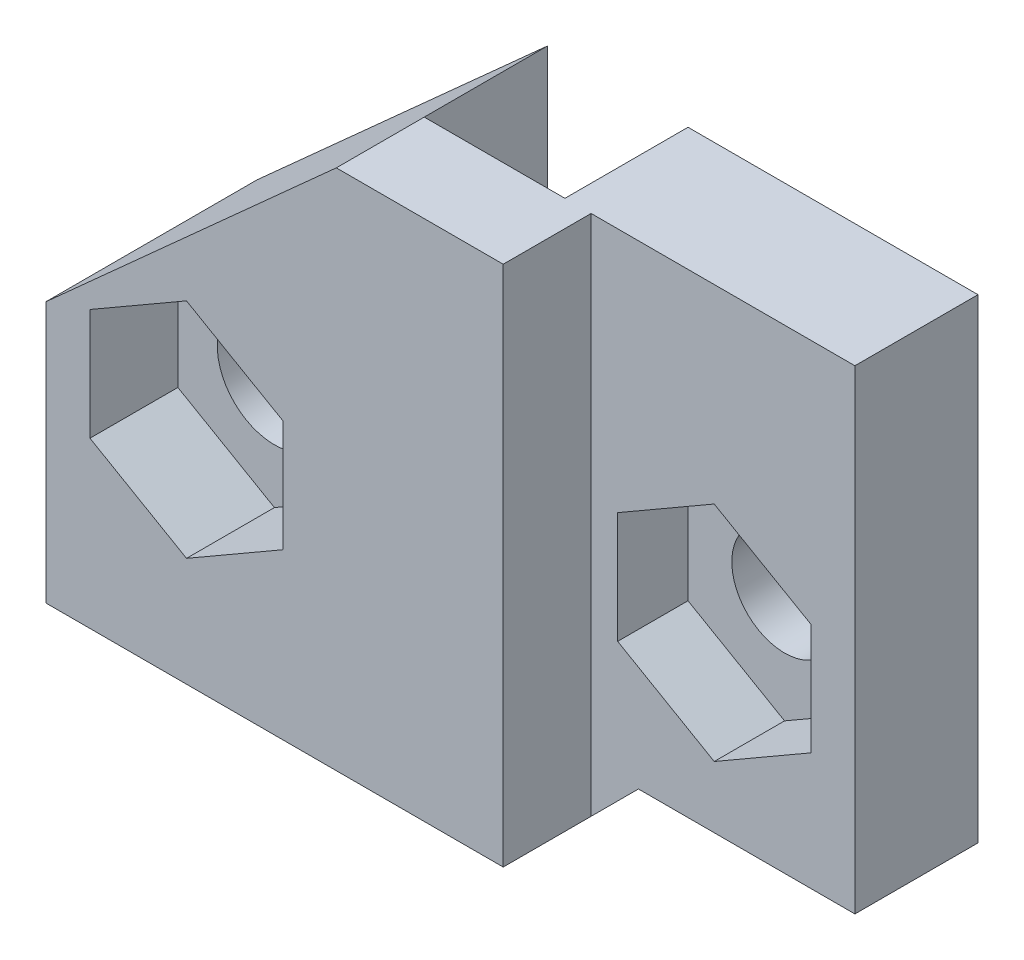
ISO-10303-21;
HEADER;
FILE_DESCRIPTION(('STEP AP214'),'2;1');
FILE_NAME('part.step','',(''),(''),'','','');
FILE_SCHEMA(('AUTOMOTIVE_DESIGN { 1 0 10303 214 1 1 1 1 }'));
ENDSEC;
DATA;
#1=APPLICATION_CONTEXT('core data for automotive mechanical design processes');
#2=APPLICATION_PROTOCOL_DEFINITION('international standard','automotive_design',2000,#1);
#3=PRODUCT_CONTEXT('',#1,'mechanical');
#4=PRODUCT('Part','Part','',(#3));
#5=PRODUCT_RELATED_PRODUCT_CATEGORY('part','',(#4));
#6=PRODUCT_DEFINITION_FORMATION('','',#4);
#7=PRODUCT_DEFINITION_CONTEXT('part definition',#1,'design');
#8=PRODUCT_DEFINITION('design','',#6,#7);
#9=PRODUCT_DEFINITION_SHAPE('','',#8);
#10=(LENGTH_UNIT() NAMED_UNIT(*) SI_UNIT(.MILLI.,.METRE.));
#11=(NAMED_UNIT(*) PLANE_ANGLE_UNIT() SI_UNIT($,.RADIAN.));
#12=(NAMED_UNIT(*) SI_UNIT($,.STERADIAN.) SOLID_ANGLE_UNIT());
#13=UNCERTAINTY_MEASURE_WITH_UNIT(LENGTH_MEASURE(1.E-05),#10,'distance_accuracy_value','');
#14=(GEOMETRIC_REPRESENTATION_CONTEXT(3) GLOBAL_UNCERTAINTY_ASSIGNED_CONTEXT((#13)) GLOBAL_UNIT_ASSIGNED_CONTEXT((#10,
#11,#12)) REPRESENTATION_CONTEXT('',''));
#15=CARTESIAN_POINT('',(0.,0.,0.));
#16=DIRECTION('',(0.,0.,1.));
#17=DIRECTION('',(1.,0.,0.));
#18=AXIS2_PLACEMENT_3D('',#15,#16,#17);
#19=CARTESIAN_POINT('',(79.72767153,-75.223646,6.));
#20=DIRECTION('',(0.,0.,-1.));
#21=DIRECTION('',(-1.,0.,0.));
#22=AXIS2_PLACEMENT_3D('',#19,#20,#21);
#23=CYLINDRICAL_SURFACE('',#22,1.625);
#24=CARTESIAN_POINT('',(79.72767153,-75.223646,0.));
#25=DIRECTION('',(0.,0.,1.));
#26=DIRECTION('',(1.,0.,0.));
#27=AXIS2_PLACEMENT_3D('',#24,#25,#26);
#28=CIRCLE('',#27,1.625);
#29=CARTESIAN_POINT('',(81.35267153,-75.223646,0.));
#30=VERTEX_POINT('',#29);
#31=EDGE_CURVE('E261',#30,#30,#28,.T.);
#32=ORIENTED_EDGE('',*,*,#31,.F.);
#33=EDGE_LOOP('',(#32));
#34=FACE_BOUND('',#33,.T.);
#35=CARTESIAN_POINT('',(79.72767153,-75.223646,3.5));
#36=DIRECTION('',(0.,0.,1.));
#37=DIRECTION('',(1.,0.,0.));
#38=AXIS2_PLACEMENT_3D('',#35,#36,#37);
#39=CIRCLE('',#38,1.625);
#40=CARTESIAN_POINT('',(81.35267153,-75.223646,3.5));
#41=VERTEX_POINT('',#40);
#42=EDGE_CURVE('E37',#41,#41,#39,.T.);
#43=ORIENTED_EDGE('',*,*,#42,.T.);
#44=EDGE_LOOP('',(#43));
#45=FACE_BOUND('',#44,.T.);
#46=ADVANCED_FACE('F33',(#34,#45),#23,.F.);
#47=CARTESIAN_POINT('',(87.9870704700034,-75.223646,6.));
#48=DIRECTION('',(1.,0.,0.));
#49=DIRECTION('',(0.,0.,-1.));
#50=AXIS2_PLACEMENT_3D('',#47,#48,#49);
#51=PLANE('',#50);
#52=DIRECTION('',(0.,1.,0.));
#53=VECTOR('',#52,1.);
#54=CARTESIAN_POINT('',(87.9870704700034,-66.648646,3.5));
#55=LINE('',#54,#53);
#56=CARTESIAN_POINT('',(87.9870704700034,-75.223646,3.5));
#57=VERTEX_POINT('',#56);
#58=CARTESIAN_POINT('',(87.9870704700034,-66.648646,3.5));
#59=VERTEX_POINT('',#58);
#60=EDGE_CURVE('E257',#57,#59,#55,.T.);
#61=ORIENTED_EDGE('',*,*,#60,.T.);
#62=DIRECTION('',(0.,0.,-1.));
#63=VECTOR('',#62,1.);
#64=CARTESIAN_POINT('',(87.9870704700034,-66.648646,6.));
#65=LINE('',#64,#63);
#66=CARTESIAN_POINT('',(87.9870704700034,-66.648646,0.));
#67=VERTEX_POINT('',#66);
#68=EDGE_CURVE('E306',#59,#67,#65,.T.);
#69=ORIENTED_EDGE('',*,*,#68,.T.);
#70=DIRECTION('',(0.,-1.,0.));
#71=VECTOR('',#70,1.);
#72=CARTESIAN_POINT('',(87.9870704700034,-75.223646,0.));
#73=LINE('',#72,#71);
#74=CARTESIAN_POINT('',(87.9870704700034,-75.223646,0.));
#75=VERTEX_POINT('',#74);
#76=EDGE_CURVE('E264',#67,#75,#73,.T.);
#77=ORIENTED_EDGE('',*,*,#76,.T.);
#78=DIRECTION('',(0.,0.,-1.));
#79=VECTOR('',#78,1.);
#80=CARTESIAN_POINT('',(87.9870704700034,-75.223646,6.));
#81=LINE('',#80,#79);
#82=EDGE_CURVE('E304',#57,#75,#81,.T.);
#83=ORIENTED_EDGE('',*,*,#82,.F.);
#84=EDGE_LOOP('',(#61,#69,#77,#83));
#85=FACE_BOUND('',#84,.T.);
#86=ADVANCED_FACE('F468',(#85),#51,.F.);
#87=CARTESIAN_POINT('',(83.9870704700034,-75.223646,6.));
#88=DIRECTION('',(0.,-1.,0.));
#89=DIRECTION('',(0.,0.,-1.));
#90=AXIS2_PLACEMENT_3D('',#87,#88,#89);
#91=PLANE('',#90);
#92=DIRECTION('',(1.,0.,0.));
#93=VECTOR('',#92,1.);
#94=CARTESIAN_POINT('',(83.9870704700034,-75.223646,3.5));
#95=LINE('',#94,#93);
#96=CARTESIAN_POINT('',(83.9870704700034,-75.223646,3.5));
#97=VERTEX_POINT('',#96);
#98=EDGE_CURVE('E254',#97,#57,#95,.T.);
#99=ORIENTED_EDGE('',*,*,#98,.T.);
#100=ORIENTED_EDGE('',*,*,#82,.T.);
#101=DIRECTION('',(-1.,0.,0.));
#102=VECTOR('',#101,1.);
#103=CARTESIAN_POINT('',(83.9870704700034,-75.223646,0.));
#104=LINE('',#103,#102);
#105=CARTESIAN_POINT('',(83.9870704700034,-75.223646,0.));
#106=VERTEX_POINT('',#105);
#107=EDGE_CURVE('E267',#75,#106,#104,.T.);
#108=ORIENTED_EDGE('',*,*,#107,.T.);
#109=DIRECTION('',(0.,0.,-1.));
#110=VECTOR('',#109,1.);
#111=CARTESIAN_POINT('',(83.9870704700034,-75.223646,6.));
#112=LINE('',#111,#110);
#113=EDGE_CURVE('E302',#97,#106,#112,.T.);
#114=ORIENTED_EDGE('',*,*,#113,.F.);
#115=EDGE_LOOP('',(#99,#100,#108,#114));
#116=FACE_BOUND('',#115,.T.);
#117=ADVANCED_FACE('F474',(#116),#91,.F.);
#118=CARTESIAN_POINT('',(83.9870704700034,-66.648646,6.));
#119=DIRECTION('',(-1.,0.,0.));
#120=DIRECTION('',(0.,0.,1.));
#121=AXIS2_PLACEMENT_3D('',#118,#119,#120);
#122=PLANE('',#121);
#123=DIRECTION('',(0.,-1.,0.));
#124=VECTOR('',#123,1.);
#125=CARTESIAN_POINT('',(83.9870704700034,-66.648646,3.5));
#126=LINE('',#125,#124);
#127=CARTESIAN_POINT('',(83.9870704700034,-66.648646,3.5));
#128=VERTEX_POINT('',#127);
#129=EDGE_CURVE('E251',#128,#97,#126,.T.);
#130=ORIENTED_EDGE('',*,*,#129,.T.);
#131=ORIENTED_EDGE('',*,*,#113,.T.);
#132=DIRECTION('',(0.,1.,0.));
#133=VECTOR('',#132,1.);
#134=CARTESIAN_POINT('',(83.9870704700034,-66.648646,0.));
#135=LINE('',#134,#133);
#136=CARTESIAN_POINT('',(83.9870704700034,-66.648646,0.));
#137=VERTEX_POINT('',#136);
#138=EDGE_CURVE('E270',#106,#137,#135,.T.);
#139=ORIENTED_EDGE('',*,*,#138,.T.);
#140=DIRECTION('',(0.,0.,-1.));
#141=VECTOR('',#140,1.);
#142=CARTESIAN_POINT('',(83.9870704700034,-66.648646,6.));
#143=LINE('',#142,#141);
#144=EDGE_CURVE('E298',#128,#137,#143,.T.);
#145=ORIENTED_EDGE('',*,*,#144,.F.);
#146=EDGE_LOOP('',(#130,#131,#139,#145));
#147=FACE_BOUND('',#146,.T.);
#148=ADVANCED_FACE('F477',(#147),#122,.F.);
#149=CARTESIAN_POINT('',(92.232371,-75.223646,3.5));
#150=DIRECTION('',(0.,0.,-1.));
#151=DIRECTION('',(-1.,0.,0.));
#152=AXIS2_PLACEMENT_3D('',#149,#150,#151);
#153=CYLINDRICAL_SURFACE('',#152,1.5);
#154=CARTESIAN_POINT('',(92.232371,-75.223646,0.));
#155=DIRECTION('',(0.,0.,1.));
#156=DIRECTION('',(1.,0.,0.));
#157=AXIS2_PLACEMENT_3D('',#154,#155,#156);
#158=CIRCLE('',#157,1.5);
#159=CARTESIAN_POINT('',(93.732371,-75.223646,0.));
#160=VERTEX_POINT('',#159);
#161=EDGE_CURVE('E360',#160,#160,#158,.T.);
#162=ORIENTED_EDGE('',*,*,#161,.F.);
#163=EDGE_LOOP('',(#162));
#164=FACE_BOUND('',#163,.T.);
#165=CARTESIAN_POINT('',(92.232371,-75.223646,1.5));
#166=DIRECTION('',(0.,0.,1.));
#167=DIRECTION('',(1.,0.,0.));
#168=AXIS2_PLACEMENT_3D('',#165,#166,#167);
#169=CIRCLE('',#168,1.5);
#170=CARTESIAN_POINT('',(93.732371,-75.223646,1.5));
#171=VERTEX_POINT('',#170);
#172=EDGE_CURVE('E349',#171,#171,#169,.T.);
#173=ORIENTED_EDGE('',*,*,#172,.T.);
#174=EDGE_LOOP('',(#173));
#175=FACE_BOUND('',#174,.T.);
#176=ADVANCED_FACE('F394',(#164,#175),#153,.F.);
#177=CARTESIAN_POINT('',(0.,0.,3.5));
#178=DIRECTION('',(0.,0.,1.));
#179=DIRECTION('',(1.,0.,0.));
#180=AXIS2_PLACEMENT_3D('',#177,#178,#179);
#181=PLANE('',#180);
#182=DIRECTION('',(-0.866025403784438,0.500000000000001,0.));
#183=VECTOR('',#182,1.);
#184=CARTESIAN_POINT('',(94.9776715299966,-73.638646,3.5));
#185=LINE('',#184,#183);
#186=CARTESIAN_POINT('',(94.9776715299966,-73.638646,3.5));
#187=VERTEX_POINT('',#186);
#188=CARTESIAN_POINT('',(92.232371,-72.053646,3.5));
#189=VERTEX_POINT('',#188);
#190=EDGE_CURVE('E311',#187,#189,#185,.T.);
#191=ORIENTED_EDGE('',*,*,#190,.F.);
#192=DIRECTION('',(0.,1.,0.));
#193=VECTOR('',#192,1.);
#194=CARTESIAN_POINT('',(94.9776715299967,-76.808646,3.5));
#195=LINE('',#194,#193);
#196=CARTESIAN_POINT('',(94.9776715299967,-76.808646,3.5));
#197=VERTEX_POINT('',#196);
#198=EDGE_CURVE('E316',#197,#187,#195,.T.);
#199=ORIENTED_EDGE('',*,*,#198,.F.);
#200=DIRECTION('',(0.866025403784437,0.500000000000004,0.));
#201=VECTOR('',#200,1.);
#202=CARTESIAN_POINT('',(92.232371,-78.393646,3.5));
#203=LINE('',#202,#201);
#204=CARTESIAN_POINT('',(92.232371,-78.393646,3.5));
#205=VERTEX_POINT('',#204);
#206=EDGE_CURVE('E342',#205,#197,#203,.T.);
#207=ORIENTED_EDGE('',*,*,#206,.F.);
#208=DIRECTION('',(0.86602540378444,-0.499999999999998,0.));
#209=VECTOR('',#208,1.);
#210=CARTESIAN_POINT('',(89.4870704700033,-76.808646,3.5));
#211=LINE('',#210,#209);
#212=CARTESIAN_POINT('',(89.4870704700033,-76.808646,3.5));
#213=VERTEX_POINT('',#212);
#214=EDGE_CURVE('E339',#213,#205,#211,.T.);
#215=ORIENTED_EDGE('',*,*,#214,.F.);
#216=DIRECTION('',(0.,-1.,0.));
#217=VECTOR('',#216,1.);
#218=CARTESIAN_POINT('',(89.4870704700033,-73.638646,3.5));
#219=LINE('',#218,#217);
#220=CARTESIAN_POINT('',(89.4870704700033,-73.638646,3.5));
#221=VERTEX_POINT('',#220);
#222=EDGE_CURVE('E336',#221,#213,#219,.T.);
#223=ORIENTED_EDGE('',*,*,#222,.F.);
#224=DIRECTION('',(-0.86602540378444,-0.499999999999998,0.));
#225=VECTOR('',#224,1.);
#226=CARTESIAN_POINT('',(92.232371,-72.053646,3.5));
#227=LINE('',#226,#225);
#228=EDGE_CURVE('E333',#189,#221,#227,.T.);
#229=ORIENTED_EDGE('',*,*,#228,.F.);
#230=EDGE_LOOP('',(#191,#199,#207,#215,#223,#229));
#231=FACE_BOUND('',#230,.T.);
#232=DIRECTION('',(0.,-1.,0.));
#233=VECTOR('',#232,1.);
#234=CARTESIAN_POINT('',(88.732371,-66.648646,3.5));
#235=LINE('',#234,#233);
#236=CARTESIAN_POINT('',(88.732371,-66.648646,3.5));
#237=VERTEX_POINT('',#236);
#238=CARTESIAN_POINT('',(88.732371,-81.493646,3.5));
#239=VERTEX_POINT('',#238);
#240=EDGE_CURVE('E364',#237,#239,#235,.T.);
#241=ORIENTED_EDGE('',*,*,#240,.T.);
#242=DIRECTION('',(0.707106781186551,0.707106781186544,0.));
#243=VECTOR('',#242,1.);
#244=CARTESIAN_POINT('',(88.732371,-81.493646,3.5));
#245=LINE('',#244,#243);
#246=CARTESIAN_POINT('',(90.077371,-80.148646,3.5));
#247=VERTEX_POINT('',#246);
#248=EDGE_CURVE('E367',#239,#247,#245,.T.);
#249=ORIENTED_EDGE('',*,*,#248,.T.);
#250=DIRECTION('',(1.,0.,0.));
#251=VECTOR('',#250,1.);
#252=CARTESIAN_POINT('',(90.077371,-80.148646,3.5));
#253=LINE('',#252,#251);
#254=CARTESIAN_POINT('',(96.232371,-80.148646,3.5));
#255=VERTEX_POINT('',#254);
#256=EDGE_CURVE('E370',#247,#255,#253,.T.);
#257=ORIENTED_EDGE('',*,*,#256,.T.);
#258=DIRECTION('',(0.,1.,0.));
#259=VECTOR('',#258,1.);
#260=CARTESIAN_POINT('',(96.232371,-66.648646,3.5));
#261=LINE('',#260,#259);
#262=CARTESIAN_POINT('',(96.232371,-66.648646,3.5));
#263=VERTEX_POINT('',#262);
#264=EDGE_CURVE('E372',#255,#263,#261,.T.);
#265=ORIENTED_EDGE('',*,*,#264,.T.);
#266=DIRECTION('',(-1.,0.,0.));
#267=VECTOR('',#266,1.);
#268=CARTESIAN_POINT('',(88.732371,-66.648646,3.5));
#269=LINE('',#268,#267);
#270=EDGE_CURVE('E374',#263,#237,#269,.T.);
#271=ORIENTED_EDGE('',*,*,#270,.T.);
#272=EDGE_LOOP('',(#241,#249,#257,#265,#271));
#273=FACE_BOUND('',#272,.T.);
#274=ADVANCED_FACE('F426',(#231,#273),#181,.T.);
#275=CARTESIAN_POINT('',(0.,0.,0.));
#276=DIRECTION('',(0.,0.,1.));
#277=DIRECTION('',(1.,0.,0.));
#278=AXIS2_PLACEMENT_3D('',#275,#276,#277);
#279=PLANE('',#278);
#280=DIRECTION('',(0.707106781186551,0.707106781186544,0.));
#281=VECTOR('',#280,1.);
#282=CARTESIAN_POINT('',(88.732371,-81.493646,0.));
#283=LINE('',#282,#281);
#284=CARTESIAN_POINT('',(88.732371,-81.493646,0.));
#285=VERTEX_POINT('',#284);
#286=CARTESIAN_POINT('',(90.077371,-80.148646,0.));
#287=VERTEX_POINT('',#286);
#288=EDGE_CURVE('E363',#285,#287,#283,.T.);
#289=ORIENTED_EDGE('',*,*,#288,.F.);
#290=DIRECTION('',(1.,0.,0.));
#291=VECTOR('',#290,1.);
#292=CARTESIAN_POINT('',(88.732371,-81.493646,0.));
#293=LINE('',#292,#291);
#294=CARTESIAN_POINT('',(75.732371,-81.493646,0.));
#295=VERTEX_POINT('',#294);
#296=EDGE_CURVE('E279',#295,#285,#293,.T.);
#297=ORIENTED_EDGE('',*,*,#296,.F.);
#298=DIRECTION('',(0.,-1.,0.));
#299=VECTOR('',#298,1.);
#300=CARTESIAN_POINT('',(75.732371,-81.493646,0.));
#301=LINE('',#300,#299);
#302=CARTESIAN_POINT('',(75.732371,-74.071146,0.));
#303=VERTEX_POINT('',#302);
#304=EDGE_CURVE('E276',#303,#295,#301,.T.);
#305=ORIENTED_EDGE('',*,*,#304,.F.);
#306=DIRECTION('',(-0.743595498868114,-0.668629743627279,0.));
#307=VECTOR('',#306,1.);
#308=CARTESIAN_POINT('',(75.732371,-74.071146,0.));
#309=LINE('',#308,#307);
#310=EDGE_CURVE('E273',#137,#303,#309,.T.);
#311=ORIENTED_EDGE('',*,*,#310,.F.);
#312=ORIENTED_EDGE('',*,*,#138,.F.);
#313=ORIENTED_EDGE('',*,*,#107,.F.);
#314=ORIENTED_EDGE('',*,*,#76,.F.);
#315=DIRECTION('',(-1.,0.,0.));
#316=VECTOR('',#315,1.);
#317=CARTESIAN_POINT('',(88.732371,-66.648646,0.));
#318=LINE('',#317,#316);
#319=CARTESIAN_POINT('',(96.232371,-66.648646,0.));
#320=VERTEX_POINT('',#319);
#321=EDGE_CURVE('E368',#320,#67,#318,.T.);
#322=ORIENTED_EDGE('',*,*,#321,.F.);
#323=DIRECTION('',(0.,1.,0.));
#324=VECTOR('',#323,1.);
#325=CARTESIAN_POINT('',(96.232371,-66.648646,0.));
#326=LINE('',#325,#324);
#327=CARTESIAN_POINT('',(96.232371,-80.148646,0.));
#328=VERTEX_POINT('',#327);
#329=EDGE_CURVE('E381',#328,#320,#326,.T.);
#330=ORIENTED_EDGE('',*,*,#329,.F.);
#331=DIRECTION('',(1.,0.,0.));
#332=VECTOR('',#331,1.);
#333=CARTESIAN_POINT('',(90.077371,-80.148646,0.));
#334=LINE('',#333,#332);
#335=EDGE_CURVE('E379',#287,#328,#334,.T.);
#336=ORIENTED_EDGE('',*,*,#335,.F.);
#337=EDGE_LOOP('',(#289,#297,#305,#311,#312,#313,#314,#322,#330,#336));
#338=FACE_BOUND('',#337,.T.);
#339=ORIENTED_EDGE('',*,*,#161,.T.);
#340=EDGE_LOOP('',(#339));
#341=FACE_BOUND('',#340,.T.);
#342=ORIENTED_EDGE('',*,*,#31,.T.);
#343=EDGE_LOOP('',(#342));
#344=FACE_BOUND('',#343,.T.);
#345=ADVANCED_FACE('F429',(#338,#341,#344),#279,.F.);
#346=CARTESIAN_POINT('',(88.732371,-81.493646,3.5));
#347=DIRECTION('',(-0.707106781186544,0.707106781186551,0.));
#348=DIRECTION('',(-0.707106781186551,-0.707106781186544,0.));
#349=AXIS2_PLACEMENT_3D('',#346,#347,#348);
#350=PLANE('',#349);
#351=ORIENTED_EDGE('',*,*,#288,.T.);
#352=DIRECTION('',(0.,0.,-1.));
#353=VECTOR('',#352,1.);
#354=CARTESIAN_POINT('',(90.077371,-80.148646,3.5));
#355=LINE('',#354,#353);
#356=EDGE_CURVE('E42',#247,#287,#355,.T.);
#357=ORIENTED_EDGE('',*,*,#356,.F.);
#358=ORIENTED_EDGE('',*,*,#248,.F.);
#359=DIRECTION('',(0.,0.,-1.));
#360=VECTOR('',#359,1.);
#361=CARTESIAN_POINT('',(88.732371,-81.493646,3.5));
#362=LINE('',#361,#360);
#363=EDGE_CURVE('E11',#239,#285,#362,.T.);
#364=ORIENTED_EDGE('',*,*,#363,.T.);
#365=EDGE_LOOP('',(#351,#357,#358,#364));
#366=FACE_BOUND('',#365,.T.);
#367=ADVANCED_FACE('F35',(#366),#350,.F.);
#368=CARTESIAN_POINT('',(90.077371,-80.148646,3.5));
#369=DIRECTION('',(0.,1.,0.));
#370=DIRECTION('',(0.,0.,1.));
#371=AXIS2_PLACEMENT_3D('',#368,#369,#370);
#372=PLANE('',#371);
#373=ORIENTED_EDGE('',*,*,#335,.T.);
#374=DIRECTION('',(0.,0.,-1.));
#375=VECTOR('',#374,1.);
#376=CARTESIAN_POINT('',(96.232371,-80.148646,3.5));
#377=LINE('',#376,#375);
#378=EDGE_CURVE('E387',#255,#328,#377,.T.);
#379=ORIENTED_EDGE('',*,*,#378,.F.);
#380=ORIENTED_EDGE('',*,*,#256,.F.);
#381=ORIENTED_EDGE('',*,*,#356,.T.);
#382=EDGE_LOOP('',(#373,#379,#380,#381));
#383=FACE_BOUND('',#382,.T.);
#384=ADVANCED_FACE('F443',(#383),#372,.F.);
#385=CARTESIAN_POINT('',(96.232371,-66.648646,3.5));
#386=DIRECTION('',(-1.,0.,0.));
#387=DIRECTION('',(0.,0.,1.));
#388=AXIS2_PLACEMENT_3D('',#385,#386,#387);
#389=PLANE('',#388);
#390=ORIENTED_EDGE('',*,*,#329,.T.);
#391=DIRECTION('',(0.,0.,-1.));
#392=VECTOR('',#391,1.);
#393=CARTESIAN_POINT('',(96.232371,-66.648646,3.5));
#394=LINE('',#393,#392);
#395=EDGE_CURVE('E377',#263,#320,#394,.T.);
#396=ORIENTED_EDGE('',*,*,#395,.F.);
#397=ORIENTED_EDGE('',*,*,#264,.F.);
#398=ORIENTED_EDGE('',*,*,#378,.T.);
#399=EDGE_LOOP('',(#390,#396,#397,#398));
#400=FACE_BOUND('',#399,.T.);
#401=ADVANCED_FACE('F447',(#400),#389,.F.);
#402=CARTESIAN_POINT('',(88.732371,-66.648646,3.5));
#403=DIRECTION('',(0.,-1.,0.));
#404=DIRECTION('',(0.,0.,-1.));
#405=AXIS2_PLACEMENT_3D('',#402,#403,#404);
#406=PLANE('',#405);
#407=ORIENTED_EDGE('',*,*,#321,.T.);
#408=ORIENTED_EDGE('',*,*,#68,.F.);
#409=DIRECTION('',(-1.,0.,0.));
#410=VECTOR('',#409,1.);
#411=CARTESIAN_POINT('',(83.9870704700034,-66.648646,3.5));
#412=LINE('',#411,#410);
#413=EDGE_CURVE('E58',#59,#128,#412,.T.);
#414=ORIENTED_EDGE('',*,*,#413,.T.);
#415=CARTESIAN_POINT('',(83.9870704700034,-66.648646,6.));
#416=VERTEX_POINT('',#415);
#417=EDGE_CURVE('E299',#416,#128,#143,.T.);
#418=ORIENTED_EDGE('',*,*,#417,.F.);
#419=DIRECTION('',(-1.,0.,0.));
#420=VECTOR('',#419,1.);
#421=CARTESIAN_POINT('',(87.9870704700034,-66.648646,6.));
#422=LINE('',#421,#420);
#423=CARTESIAN_POINT('',(88.732371,-66.648646,6.));
#424=VERTEX_POINT('',#423);
#425=EDGE_CURVE('E284',#424,#416,#422,.T.);
#426=ORIENTED_EDGE('',*,*,#425,.F.);
#427=DIRECTION('',(0.,0.,-1.));
#428=VECTOR('',#427,1.);
#429=CARTESIAN_POINT('',(88.732371,-66.648646,6.));
#430=LINE('',#429,#428);
#431=EDGE_CURVE('E308',#424,#237,#430,.T.);
#432=ORIENTED_EDGE('',*,*,#431,.T.);
#433=ORIENTED_EDGE('',*,*,#270,.F.);
#434=ORIENTED_EDGE('',*,*,#395,.T.);
#435=EDGE_LOOP('',(#407,#408,#414,#418,#426,#432,#433,#434));
#436=FACE_BOUND('',#435,.T.);
#437=ADVANCED_FACE('F450',(#436),#406,.F.);
#438=CARTESIAN_POINT('',(94.9776715299966,-73.638646,1.5));
#439=DIRECTION('',(0.500000000000001,0.866025403784438,0.));
#440=DIRECTION('',(-0.866025403784438,0.500000000000001,0.));
#441=AXIS2_PLACEMENT_3D('',#438,#439,#440);
#442=PLANE('',#441);
#443=ORIENTED_EDGE('',*,*,#190,.T.);
#444=DIRECTION('',(0.,0.,1.));
#445=VECTOR('',#444,1.);
#446=CARTESIAN_POINT('',(92.232371,-72.053646,1.5));
#447=LINE('',#446,#445);
#448=CARTESIAN_POINT('',(92.232371,-72.053646,1.5));
#449=VERTEX_POINT('',#448);
#450=EDGE_CURVE('E331',#449,#189,#447,.T.);
#451=ORIENTED_EDGE('',*,*,#450,.F.);
#452=DIRECTION('',(-0.866025403784438,0.500000000000001,0.));
#453=VECTOR('',#452,1.);
#454=CARTESIAN_POINT('',(94.9776715299966,-73.638646,1.5));
#455=LINE('',#454,#453);
#456=CARTESIAN_POINT('',(94.9776715299966,-73.638646,1.5));
#457=VERTEX_POINT('',#456);
#458=EDGE_CURVE('E312',#457,#449,#455,.T.);
#459=ORIENTED_EDGE('',*,*,#458,.F.);
#460=DIRECTION('',(0.,0.,1.));
#461=VECTOR('',#460,1.);
#462=CARTESIAN_POINT('',(94.9776715299966,-73.638646,1.5));
#463=LINE('',#462,#461);
#464=EDGE_CURVE('E347',#457,#187,#463,.T.);
#465=ORIENTED_EDGE('',*,*,#464,.T.);
#466=EDGE_LOOP('',(#443,#451,#459,#465));
#467=FACE_BOUND('',#466,.T.);
#468=ADVANCED_FACE('F406',(#467),#442,.F.);
#469=CARTESIAN_POINT('',(94.9776715299967,-76.808646,1.5));
#470=DIRECTION('',(1.,0.,0.));
#471=DIRECTION('',(0.,1.,0.));
#472=AXIS2_PLACEMENT_3D('',#469,#470,#471);
#473=PLANE('',#472);
#474=ORIENTED_EDGE('',*,*,#198,.T.);
#475=ORIENTED_EDGE('',*,*,#464,.F.);
#476=DIRECTION('',(0.,1.,0.));
#477=VECTOR('',#476,1.);
#478=CARTESIAN_POINT('',(94.9776715299967,-76.808646,1.5));
#479=LINE('',#478,#477);
#480=CARTESIAN_POINT('',(94.9776715299967,-76.808646,1.5));
#481=VERTEX_POINT('',#480);
#482=EDGE_CURVE('E328',#481,#457,#479,.T.);
#483=ORIENTED_EDGE('',*,*,#482,.F.);
#484=DIRECTION('',(0.,0.,1.));
#485=VECTOR('',#484,1.);
#486=CARTESIAN_POINT('',(94.9776715299967,-76.808646,1.5));
#487=LINE('',#486,#485);
#488=EDGE_CURVE('E350',#481,#197,#487,.T.);
#489=ORIENTED_EDGE('',*,*,#488,.T.);
#490=EDGE_LOOP('',(#474,#475,#483,#489));
#491=FACE_BOUND('',#490,.T.);
#492=ADVANCED_FACE('F424',(#491),#473,.F.);
#493=CARTESIAN_POINT('',(92.232371,-78.393646,1.5));
#494=DIRECTION('',(0.500000000000003,-0.866025403784437,0.));
#495=DIRECTION('',(0.866025403784437,0.500000000000004,0.));
#496=AXIS2_PLACEMENT_3D('',#493,#494,#495);
#497=PLANE('',#496);
#498=ORIENTED_EDGE('',*,*,#206,.T.);
#499=ORIENTED_EDGE('',*,*,#488,.F.);
#500=DIRECTION('',(0.866025403784437,0.500000000000004,0.));
#501=VECTOR('',#500,1.);
#502=CARTESIAN_POINT('',(92.232371,-78.393646,1.5));
#503=LINE('',#502,#501);
#504=CARTESIAN_POINT('',(92.232371,-78.393646,1.5));
#505=VERTEX_POINT('',#504);
#506=EDGE_CURVE('E325',#505,#481,#503,.T.);
#507=ORIENTED_EDGE('',*,*,#506,.F.);
#508=DIRECTION('',(0.,0.,1.));
#509=VECTOR('',#508,1.);
#510=CARTESIAN_POINT('',(92.232371,-78.393646,1.5));
#511=LINE('',#510,#509);
#512=EDGE_CURVE('E352',#505,#205,#511,.T.);
#513=ORIENTED_EDGE('',*,*,#512,.T.);
#514=EDGE_LOOP('',(#498,#499,#507,#513));
#515=FACE_BOUND('',#514,.T.);
#516=ADVANCED_FACE('F421',(#515),#497,.F.);
#517=CARTESIAN_POINT('',(89.4870704700033,-76.808646,1.5));
#518=DIRECTION('',(-0.499999999999998,-0.86602540378444,0.));
#519=DIRECTION('',(0.86602540378444,-0.499999999999998,0.));
#520=AXIS2_PLACEMENT_3D('',#517,#518,#519);
#521=PLANE('',#520);
#522=ORIENTED_EDGE('',*,*,#214,.T.);
#523=ORIENTED_EDGE('',*,*,#512,.F.);
#524=DIRECTION('',(0.86602540378444,-0.499999999999998,0.));
#525=VECTOR('',#524,1.);
#526=CARTESIAN_POINT('',(89.4870704700033,-76.808646,1.5));
#527=LINE('',#526,#525);
#528=CARTESIAN_POINT('',(89.4870704700033,-76.808646,1.5));
#529=VERTEX_POINT('',#528);
#530=EDGE_CURVE('E322',#529,#505,#527,.T.);
#531=ORIENTED_EDGE('',*,*,#530,.F.);
#532=DIRECTION('',(0.,0.,1.));
#533=VECTOR('',#532,1.);
#534=CARTESIAN_POINT('',(89.4870704700033,-76.808646,1.5));
#535=LINE('',#534,#533);
#536=EDGE_CURVE('E354',#529,#213,#535,.T.);
#537=ORIENTED_EDGE('',*,*,#536,.T.);
#538=EDGE_LOOP('',(#522,#523,#531,#537));
#539=FACE_BOUND('',#538,.T.);
#540=ADVANCED_FACE('F417',(#539),#521,.F.);
#541=CARTESIAN_POINT('',(89.4870704700033,-73.638646,1.5));
#542=DIRECTION('',(-1.,0.,0.));
#543=DIRECTION('',(0.,0.,1.));
#544=AXIS2_PLACEMENT_3D('',#541,#542,#543);
#545=PLANE('',#544);
#546=ORIENTED_EDGE('',*,*,#222,.T.);
#547=ORIENTED_EDGE('',*,*,#536,.F.);
#548=DIRECTION('',(0.,-1.,0.));
#549=VECTOR('',#548,1.);
#550=CARTESIAN_POINT('',(89.4870704700033,-73.638646,1.5));
#551=LINE('',#550,#549);
#552=CARTESIAN_POINT('',(89.4870704700033,-73.638646,1.5));
#553=VERTEX_POINT('',#552);
#554=EDGE_CURVE('E319',#553,#529,#551,.T.);
#555=ORIENTED_EDGE('',*,*,#554,.F.);
#556=DIRECTION('',(0.,0.,1.));
#557=VECTOR('',#556,1.);
#558=CARTESIAN_POINT('',(89.4870704700033,-73.638646,1.5));
#559=LINE('',#558,#557);
#560=EDGE_CURVE('E356',#553,#221,#559,.T.);
#561=ORIENTED_EDGE('',*,*,#560,.T.);
#562=EDGE_LOOP('',(#546,#547,#555,#561));
#563=FACE_BOUND('',#562,.T.);
#564=ADVANCED_FACE('F413',(#563),#545,.F.);
#565=CARTESIAN_POINT('',(92.232371,-72.053646,1.5));
#566=DIRECTION('',(-0.499999999999998,0.86602540378444,0.));
#567=DIRECTION('',(-0.86602540378444,-0.499999999999998,0.));
#568=AXIS2_PLACEMENT_3D('',#565,#566,#567);
#569=PLANE('',#568);
#570=ORIENTED_EDGE('',*,*,#228,.T.);
#571=ORIENTED_EDGE('',*,*,#560,.F.);
#572=DIRECTION('',(-0.86602540378444,-0.499999999999998,0.));
#573=VECTOR('',#572,1.);
#574=CARTESIAN_POINT('',(92.232371,-72.053646,1.5));
#575=LINE('',#574,#573);
#576=EDGE_CURVE('E315',#449,#553,#575,.T.);
#577=ORIENTED_EDGE('',*,*,#576,.F.);
#578=ORIENTED_EDGE('',*,*,#450,.T.);
#579=EDGE_LOOP('',(#570,#571,#577,#578));
#580=FACE_BOUND('',#579,.T.);
#581=ADVANCED_FACE('F400',(#580),#569,.F.);
#582=CARTESIAN_POINT('',(0.,0.,1.5));
#583=DIRECTION('',(0.,0.,1.));
#584=DIRECTION('',(1.,0.,0.));
#585=AXIS2_PLACEMENT_3D('',#582,#583,#584);
#586=PLANE('',#585);
#587=ORIENTED_EDGE('',*,*,#172,.F.);
#588=EDGE_LOOP('',(#587));
#589=FACE_BOUND('',#588,.T.);
#590=ORIENTED_EDGE('',*,*,#458,.T.);
#591=ORIENTED_EDGE('',*,*,#576,.T.);
#592=ORIENTED_EDGE('',*,*,#554,.T.);
#593=ORIENTED_EDGE('',*,*,#530,.T.);
#594=ORIENTED_EDGE('',*,*,#506,.T.);
#595=ORIENTED_EDGE('',*,*,#482,.T.);
#596=EDGE_LOOP('',(#590,#591,#592,#593,#594,#595));
#597=FACE_BOUND('',#596,.T.);
#598=ADVANCED_FACE('F396',(#589,#597),#586,.T.);
#599=CARTESIAN_POINT('',(0.,0.,6.));
#600=DIRECTION('',(0.,0.,-1.));
#601=DIRECTION('',(-1.,0.,0.));
#602=AXIS2_PLACEMENT_3D('',#599,#600,#601);
#603=PLANE('',#602);
#604=DIRECTION('',(0.866025403784441,0.499999999999996,0.));
#605=VECTOR('',#604,1.);
#606=CARTESIAN_POINT('',(79.72767153,-78.3936459999997,6.));
#607=LINE('',#606,#605);
#608=CARTESIAN_POINT('',(79.72767153,-78.3936459999997,6.));
#609=VERTEX_POINT('',#608);
#610=CARTESIAN_POINT('',(82.4729720599964,-76.8086459999999,6.));
#611=VERTEX_POINT('',#610);
#612=EDGE_CURVE('E232',#609,#611,#607,.T.);
#613=ORIENTED_EDGE('',*,*,#612,.F.);
#614=DIRECTION('',(0.866025403784439,-0.499999999999999,0.));
#615=VECTOR('',#614,1.);
#616=CARTESIAN_POINT('',(76.9823710000036,-76.8086459999999,6.));
#617=LINE('',#616,#615);
#618=CARTESIAN_POINT('',(76.9823710000036,-76.8086459999999,6.));
#619=VERTEX_POINT('',#618);
#620=EDGE_CURVE('E50',#619,#609,#617,.T.);
#621=ORIENTED_EDGE('',*,*,#620,.F.);
#622=DIRECTION('',(0.,-1.,0.));
#623=VECTOR('',#622,1.);
#624=CARTESIAN_POINT('',(76.9823710000036,-73.6386460000002,6.));
#625=LINE('',#624,#623);
#626=CARTESIAN_POINT('',(76.9823710000036,-73.6386460000002,6.));
#627=VERTEX_POINT('',#626);
#628=EDGE_CURVE('E218',#627,#619,#625,.T.);
#629=ORIENTED_EDGE('',*,*,#628,.F.);
#630=DIRECTION('',(-0.866025403784437,-0.500000000000003,0.));
#631=VECTOR('',#630,1.);
#632=CARTESIAN_POINT('',(79.72767153,-72.0536460000003,6.));
#633=LINE('',#632,#631);
#634=CARTESIAN_POINT('',(79.72767153,-72.0536460000003,6.));
#635=VERTEX_POINT('',#634);
#636=EDGE_CURVE('E221',#635,#627,#633,.T.);
#637=ORIENTED_EDGE('',*,*,#636,.F.);
#638=DIRECTION('',(-0.866025403784441,0.499999999999996,0.));
#639=VECTOR('',#638,1.);
#640=CARTESIAN_POINT('',(82.4729720599964,-73.6386460000002,6.));
#641=LINE('',#640,#639);
#642=CARTESIAN_POINT('',(82.4729720599964,-73.6386460000002,6.));
#643=VERTEX_POINT('',#642);
#644=EDGE_CURVE('E237',#643,#635,#641,.T.);
#645=ORIENTED_EDGE('',*,*,#644,.F.);
#646=DIRECTION('',(0.,1.,0.));
#647=VECTOR('',#646,1.);
#648=CARTESIAN_POINT('',(82.4729720599964,-76.8086459999999,6.));
#649=LINE('',#648,#647);
#650=EDGE_CURVE('E234',#611,#643,#649,.T.);
#651=ORIENTED_EDGE('',*,*,#650,.F.);
#652=EDGE_LOOP('',(#613,#621,#629,#637,#645,#651));
#653=FACE_BOUND('',#652,.T.);
#654=DIRECTION('',(0.,1.,0.));
#655=VECTOR('',#654,1.);
#656=CARTESIAN_POINT('',(88.732371,-66.648646,6.));
#657=LINE('',#656,#655);
#658=CARTESIAN_POINT('',(88.732371,-81.493646,6.));
#659=VERTEX_POINT('',#658);
#660=EDGE_CURVE('E281',#659,#424,#657,.T.);
#661=ORIENTED_EDGE('',*,*,#660,.T.);
#662=ORIENTED_EDGE('',*,*,#425,.T.);
#663=DIRECTION('',(-0.743595498868114,-0.668629743627279,0.));
#664=VECTOR('',#663,1.);
#665=CARTESIAN_POINT('',(75.732371,-74.071146,6.));
#666=LINE('',#665,#664);
#667=CARTESIAN_POINT('',(75.732371,-74.071146,6.));
#668=VERTEX_POINT('',#667);
#669=EDGE_CURVE('E286',#416,#668,#666,.T.);
#670=ORIENTED_EDGE('',*,*,#669,.T.);
#671=DIRECTION('',(0.,-1.,0.));
#672=VECTOR('',#671,1.);
#673=CARTESIAN_POINT('',(75.732371,-81.493646,6.));
#674=LINE('',#673,#672);
#675=CARTESIAN_POINT('',(75.732371,-81.493646,6.));
#676=VERTEX_POINT('',#675);
#677=EDGE_CURVE('E288',#668,#676,#674,.T.);
#678=ORIENTED_EDGE('',*,*,#677,.T.);
#679=DIRECTION('',(1.,0.,0.));
#680=VECTOR('',#679,1.);
#681=CARTESIAN_POINT('',(88.732371,-81.493646,6.));
#682=LINE('',#681,#680);
#683=EDGE_CURVE('E290',#676,#659,#682,.T.);
#684=ORIENTED_EDGE('',*,*,#683,.T.);
#685=EDGE_LOOP('',(#661,#662,#670,#678,#684));
#686=FACE_BOUND('',#685,.T.);
#687=ADVANCED_FACE('F399',(#653,#686),#603,.F.);
#688=CARTESIAN_POINT('',(88.732371,-66.648646,6.));
#689=DIRECTION('',(-1.,0.,0.));
#690=DIRECTION('',(0.,0.,1.));
#691=AXIS2_PLACEMENT_3D('',#688,#689,#690);
#692=PLANE('',#691);
#693=ORIENTED_EDGE('',*,*,#240,.F.);
#694=ORIENTED_EDGE('',*,*,#431,.F.);
#695=ORIENTED_EDGE('',*,*,#660,.F.);
#696=DIRECTION('',(0.,0.,-1.));
#697=VECTOR('',#696,1.);
#698=CARTESIAN_POINT('',(88.732371,-81.493646,6.));
#699=LINE('',#698,#697);
#700=EDGE_CURVE('E292',#659,#239,#699,.T.);
#701=ORIENTED_EDGE('',*,*,#700,.T.);
#702=EDGE_LOOP('',(#693,#694,#695,#701));
#703=FACE_BOUND('',#702,.T.);
#704=ADVANCED_FACE('F452',(#703),#692,.F.);
#705=CARTESIAN_POINT('',(75.732371,-74.071146,6.));
#706=DIRECTION('',(0.668629743627279,-0.743595498868114,0.));
#707=DIRECTION('',(0.743595498868114,0.668629743627278,0.));
#708=AXIS2_PLACEMENT_3D('',#705,#706,#707);
#709=PLANE('',#708);
#710=ORIENTED_EDGE('',*,*,#417,.T.);
#711=ORIENTED_EDGE('',*,*,#144,.T.);
#712=ORIENTED_EDGE('',*,*,#310,.T.);
#713=DIRECTION('',(0.,0.,-1.));
#714=VECTOR('',#713,1.);
#715=CARTESIAN_POINT('',(75.732371,-74.071146,6.));
#716=LINE('',#715,#714);
#717=EDGE_CURVE('E296',#668,#303,#716,.T.);
#718=ORIENTED_EDGE('',*,*,#717,.F.);
#719=ORIENTED_EDGE('',*,*,#669,.F.);
#720=EDGE_LOOP('',(#710,#711,#712,#718,#719));
#721=FACE_BOUND('',#720,.T.);
#722=ADVANCED_FACE('F481',(#721),#709,.F.);
#723=CARTESIAN_POINT('',(75.732371,-81.493646,6.));
#724=DIRECTION('',(1.,0.,0.));
#725=DIRECTION('',(0.,0.,-1.));
#726=AXIS2_PLACEMENT_3D('',#723,#724,#725);
#727=PLANE('',#726);
#728=ORIENTED_EDGE('',*,*,#717,.T.);
#729=ORIENTED_EDGE('',*,*,#304,.T.);
#730=DIRECTION('',(0.,0.,-1.));
#731=VECTOR('',#730,1.);
#732=CARTESIAN_POINT('',(75.732371,-81.493646,6.));
#733=LINE('',#732,#731);
#734=EDGE_CURVE('E294',#676,#295,#733,.T.);
#735=ORIENTED_EDGE('',*,*,#734,.F.);
#736=ORIENTED_EDGE('',*,*,#677,.F.);
#737=EDGE_LOOP('',(#728,#729,#735,#736));
#738=FACE_BOUND('',#737,.T.);
#739=ADVANCED_FACE('F484',(#738),#727,.F.);
#740=CARTESIAN_POINT('',(88.732371,-81.493646,6.));
#741=DIRECTION('',(0.,1.,0.));
#742=DIRECTION('',(0.,0.,1.));
#743=AXIS2_PLACEMENT_3D('',#740,#741,#742);
#744=PLANE('',#743);
#745=ORIENTED_EDGE('',*,*,#734,.T.);
#746=ORIENTED_EDGE('',*,*,#296,.T.);
#747=ORIENTED_EDGE('',*,*,#363,.F.);
#748=ORIENTED_EDGE('',*,*,#700,.F.);
#749=ORIENTED_EDGE('',*,*,#683,.F.);
#750=EDGE_LOOP('',(#745,#746,#747,#748,#749));
#751=FACE_BOUND('',#750,.T.);
#752=ADVANCED_FACE('F459',(#751),#744,.F.);
#753=CARTESIAN_POINT('',(0.,0.,3.5));
#754=DIRECTION('',(0.,0.,1.));
#755=DIRECTION('',(1.,0.,0.));
#756=AXIS2_PLACEMENT_3D('',#753,#754,#755);
#757=PLANE('',#756);
#758=ORIENTED_EDGE('',*,*,#129,.F.);
#759=ORIENTED_EDGE('',*,*,#413,.F.);
#760=ORIENTED_EDGE('',*,*,#60,.F.);
#761=ORIENTED_EDGE('',*,*,#98,.F.);
#762=EDGE_LOOP('',(#758,#759,#760,#761));
#763=FACE_BOUND('',#762,.T.);
#764=ADVANCED_FACE('F471',(#763),#757,.F.);
#765=CARTESIAN_POINT('',(76.9823710000036,-76.8086459999999,3.5));
#766=DIRECTION('',(-0.499999999999999,-0.866025403784439,0.));
#767=DIRECTION('',(0.866025403784439,-0.499999999999999,0.));
#768=AXIS2_PLACEMENT_3D('',#765,#766,#767);
#769=PLANE('',#768);
#770=ORIENTED_EDGE('',*,*,#620,.T.);
#771=DIRECTION('',(0.,0.,1.));
#772=VECTOR('',#771,1.);
#773=CARTESIAN_POINT('',(79.72767153,-78.3936459999997,3.5));
#774=LINE('',#773,#772);
#775=CARTESIAN_POINT('',(79.72767153,-78.3936459999997,3.5));
#776=VERTEX_POINT('',#775);
#777=EDGE_CURVE('E195',#776,#609,#774,.T.);
#778=ORIENTED_EDGE('',*,*,#777,.F.);
#779=DIRECTION('',(0.866025403784439,-0.499999999999999,0.));
#780=VECTOR('',#779,1.);
#781=CARTESIAN_POINT('',(76.9823710000036,-76.8086459999999,3.5));
#782=LINE('',#781,#780);
#783=CARTESIAN_POINT('',(76.9823710000036,-76.8086459999999,3.5));
#784=VERTEX_POINT('',#783);
#785=EDGE_CURVE('E199',#784,#776,#782,.T.);
#786=ORIENTED_EDGE('',*,*,#785,.F.);
#787=DIRECTION('',(0.,0.,1.));
#788=VECTOR('',#787,1.);
#789=CARTESIAN_POINT('',(76.9823710000036,-76.8086459999999,3.5));
#790=LINE('',#789,#788);
#791=EDGE_CURVE('E242',#784,#619,#790,.T.);
#792=ORIENTED_EDGE('',*,*,#791,.T.);
#793=EDGE_LOOP('',(#770,#778,#786,#792));
#794=FACE_BOUND('',#793,.T.);
#795=ADVANCED_FACE('F197',(#794),#769,.F.);
#796=CARTESIAN_POINT('',(76.9823710000036,-73.6386460000002,3.5));
#797=DIRECTION('',(-1.,0.,0.));
#798=DIRECTION('',(0.,-1.,0.));
#799=AXIS2_PLACEMENT_3D('',#796,#797,#798);
#800=PLANE('',#799);
#801=ORIENTED_EDGE('',*,*,#628,.T.);
#802=ORIENTED_EDGE('',*,*,#791,.F.);
#803=DIRECTION('',(0.,-1.,0.));
#804=VECTOR('',#803,1.);
#805=CARTESIAN_POINT('',(76.9823710000036,-73.6386460000002,3.5));
#806=LINE('',#805,#804);
#807=CARTESIAN_POINT('',(76.9823710000036,-73.6386460000002,3.5));
#808=VERTEX_POINT('',#807);
#809=EDGE_CURVE('E205',#808,#784,#806,.T.);
#810=ORIENTED_EDGE('',*,*,#809,.F.);
#811=DIRECTION('',(0.,0.,1.));
#812=VECTOR('',#811,1.);
#813=CARTESIAN_POINT('',(76.9823710000036,-73.6386460000002,3.5));
#814=LINE('',#813,#812);
#815=EDGE_CURVE('E244',#808,#627,#814,.T.);
#816=ORIENTED_EDGE('',*,*,#815,.T.);
#817=EDGE_LOOP('',(#801,#802,#810,#816));
#818=FACE_BOUND('',#817,.T.);
#819=ADVANCED_FACE('F524',(#818),#800,.F.);
#820=CARTESIAN_POINT('',(79.72767153,-72.0536460000003,3.5));
#821=DIRECTION('',(-0.500000000000003,0.866025403784437,0.));
#822=DIRECTION('',(-0.866025403784437,-0.500000000000003,0.));
#823=AXIS2_PLACEMENT_3D('',#820,#821,#822);
#824=PLANE('',#823);
#825=ORIENTED_EDGE('',*,*,#636,.T.);
#826=ORIENTED_EDGE('',*,*,#815,.F.);
#827=DIRECTION('',(-0.866025403784437,-0.500000000000003,0.));
#828=VECTOR('',#827,1.);
#829=CARTESIAN_POINT('',(79.72767153,-72.0536460000003,3.5));
#830=LINE('',#829,#828);
#831=CARTESIAN_POINT('',(79.72767153,-72.0536460000003,3.5));
#832=VERTEX_POINT('',#831);
#833=EDGE_CURVE('E228',#832,#808,#830,.T.);
#834=ORIENTED_EDGE('',*,*,#833,.F.);
#835=DIRECTION('',(0.,0.,1.));
#836=VECTOR('',#835,1.);
#837=CARTESIAN_POINT('',(79.72767153,-72.0536460000003,3.5));
#838=LINE('',#837,#836);
#839=EDGE_CURVE('E246',#832,#635,#838,.T.);
#840=ORIENTED_EDGE('',*,*,#839,.T.);
#841=EDGE_LOOP('',(#825,#826,#834,#840));
#842=FACE_BOUND('',#841,.T.);
#843=ADVANCED_FACE('F522',(#842),#824,.F.);
#844=CARTESIAN_POINT('',(82.4729720599964,-73.6386460000002,3.5));
#845=DIRECTION('',(0.499999999999996,0.866025403784441,0.));
#846=DIRECTION('',(-0.866025403784441,0.499999999999996,0.));
#847=AXIS2_PLACEMENT_3D('',#844,#845,#846);
#848=PLANE('',#847);
#849=ORIENTED_EDGE('',*,*,#644,.T.);
#850=ORIENTED_EDGE('',*,*,#839,.F.);
#851=DIRECTION('',(-0.866025403784441,0.499999999999996,0.));
#852=VECTOR('',#851,1.);
#853=CARTESIAN_POINT('',(82.4729720599964,-73.6386460000002,3.5));
#854=LINE('',#853,#852);
#855=CARTESIAN_POINT('',(82.4729720599964,-73.6386460000002,3.5));
#856=VERTEX_POINT('',#855);
#857=EDGE_CURVE('E225',#856,#832,#854,.T.);
#858=ORIENTED_EDGE('',*,*,#857,.F.);
#859=DIRECTION('',(0.,0.,1.));
#860=VECTOR('',#859,1.);
#861=CARTESIAN_POINT('',(82.4729720599964,-73.6386460000002,3.5));
#862=LINE('',#861,#860);
#863=EDGE_CURVE('E248',#856,#643,#862,.T.);
#864=ORIENTED_EDGE('',*,*,#863,.T.);
#865=EDGE_LOOP('',(#849,#850,#858,#864));
#866=FACE_BOUND('',#865,.T.);
#867=ADVANCED_FACE('F520',(#866),#848,.F.);
#868=CARTESIAN_POINT('',(82.4729720599964,-76.8086459999999,3.5));
#869=DIRECTION('',(1.,0.,0.));
#870=DIRECTION('',(0.,0.,-1.));
#871=AXIS2_PLACEMENT_3D('',#868,#869,#870);
#872=PLANE('',#871);
#873=ORIENTED_EDGE('',*,*,#650,.T.);
#874=ORIENTED_EDGE('',*,*,#863,.F.);
#875=DIRECTION('',(0.,1.,0.));
#876=VECTOR('',#875,1.);
#877=CARTESIAN_POINT('',(82.4729720599964,-76.8086459999999,3.5));
#878=LINE('',#877,#876);
#879=CARTESIAN_POINT('',(82.4729720599964,-76.8086459999999,3.5));
#880=VERTEX_POINT('',#879);
#881=EDGE_CURVE('E213',#880,#856,#878,.T.);
#882=ORIENTED_EDGE('',*,*,#881,.F.);
#883=DIRECTION('',(0.,0.,1.));
#884=VECTOR('',#883,1.);
#885=CARTESIAN_POINT('',(82.4729720599964,-76.8086459999999,3.5));
#886=LINE('',#885,#884);
#887=EDGE_CURVE('E204',#880,#611,#886,.T.);
#888=ORIENTED_EDGE('',*,*,#887,.T.);
#889=EDGE_LOOP('',(#873,#874,#882,#888));
#890=FACE_BOUND('',#889,.T.);
#891=ADVANCED_FACE('F516',(#890),#872,.F.);
#892=CARTESIAN_POINT('',(79.72767153,-78.3936459999997,3.5));
#893=DIRECTION('',(0.499999999999996,-0.866025403784441,0.));
#894=DIRECTION('',(0.866025403784441,0.499999999999996,0.));
#895=AXIS2_PLACEMENT_3D('',#892,#893,#894);
#896=PLANE('',#895);
#897=ORIENTED_EDGE('',*,*,#612,.T.);
#898=ORIENTED_EDGE('',*,*,#887,.F.);
#899=DIRECTION('',(0.866025403784441,0.499999999999996,0.));
#900=VECTOR('',#899,1.);
#901=CARTESIAN_POINT('',(79.72767153,-78.3936459999997,3.5));
#902=LINE('',#901,#900);
#903=EDGE_CURVE('E208',#776,#880,#902,.T.);
#904=ORIENTED_EDGE('',*,*,#903,.F.);
#905=ORIENTED_EDGE('',*,*,#777,.T.);
#906=EDGE_LOOP('',(#897,#898,#904,#905));
#907=FACE_BOUND('',#906,.T.);
#908=ADVANCED_FACE('F209',(#907),#896,.F.);
#909=CARTESIAN_POINT('',(0.,0.,3.5));
#910=DIRECTION('',(0.,0.,1.));
#911=DIRECTION('',(1.,0.,0.));
#912=AXIS2_PLACEMENT_3D('',#909,#910,#911);
#913=PLANE('',#912);
#914=ORIENTED_EDGE('',*,*,#42,.F.);
#915=EDGE_LOOP('',(#914));
#916=FACE_BOUND('',#915,.T.);
#917=ORIENTED_EDGE('',*,*,#785,.T.);
#918=ORIENTED_EDGE('',*,*,#903,.T.);
#919=ORIENTED_EDGE('',*,*,#881,.T.);
#920=ORIENTED_EDGE('',*,*,#857,.T.);
#921=ORIENTED_EDGE('',*,*,#833,.T.);
#922=ORIENTED_EDGE('',*,*,#809,.T.);
#923=EDGE_LOOP('',(#917,#918,#919,#920,#921,#922));
#924=FACE_BOUND('',#923,.T.);
#925=ADVANCED_FACE('F215',(#916,#924),#913,.T.);
#926=CLOSED_SHELL('',(#46,#86,#117,#148,#176,#274,#345,#367,#384,#401,#437,#468,#492,#516,#540,
#564,#581,#598,#687,#704,#722,#739,#752,#764,#795,#819,#843,#867,#891,#908,#925));
#927=MANIFOLD_SOLID_BREP('B2',#926);
#928=ADVANCED_BREP_SHAPE_REPRESENTATION('',(#18,#927),#14);
#929=SHAPE_DEFINITION_REPRESENTATION(#9,#928);
ENDSEC;
END-ISO-10303-21;
